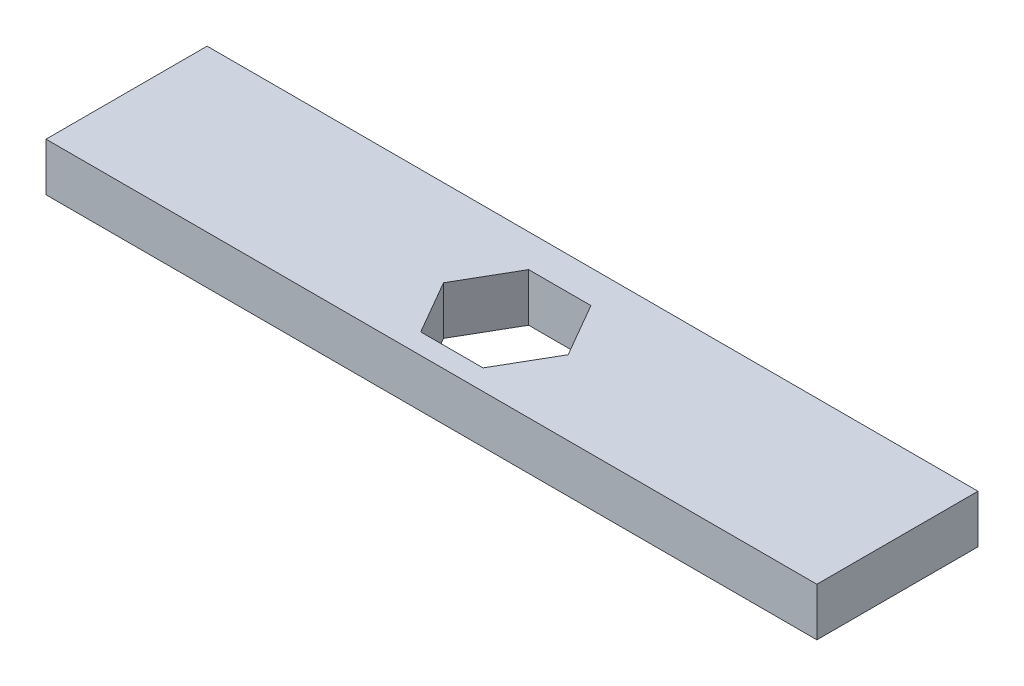
ISO-10303-21;
HEADER;
FILE_DESCRIPTION(('STEP AP214'),'2;1');
FILE_NAME('part.step','',(''),(''),'','','');
FILE_SCHEMA(('AUTOMOTIVE_DESIGN { 1 0 10303 214 1 1 1 1 }'));
ENDSEC;
DATA;
#1=APPLICATION_CONTEXT('core data for automotive mechanical design processes');
#2=APPLICATION_PROTOCOL_DEFINITION('international standard','automotive_design',2000,#1);
#3=PRODUCT_CONTEXT('',#1,'mechanical');
#4=PRODUCT('Part','Part','',(#3));
#5=PRODUCT_RELATED_PRODUCT_CATEGORY('part','',(#4));
#6=PRODUCT_DEFINITION_FORMATION('','',#4);
#7=PRODUCT_DEFINITION_CONTEXT('part definition',#1,'design');
#8=PRODUCT_DEFINITION('design','',#6,#7);
#9=PRODUCT_DEFINITION_SHAPE('','',#8);
#10=(LENGTH_UNIT() NAMED_UNIT(*) SI_UNIT(.MILLI.,.METRE.));
#11=(NAMED_UNIT(*) PLANE_ANGLE_UNIT() SI_UNIT($,.RADIAN.));
#12=(NAMED_UNIT(*) SI_UNIT($,.STERADIAN.) SOLID_ANGLE_UNIT());
#13=UNCERTAINTY_MEASURE_WITH_UNIT(LENGTH_MEASURE(1.E-05),#10,'distance_accuracy_value','');
#14=(GEOMETRIC_REPRESENTATION_CONTEXT(3) GLOBAL_UNCERTAINTY_ASSIGNED_CONTEXT((#13)) GLOBAL_UNIT_ASSIGNED_CONTEXT((#10,
#11,#12)) REPRESENTATION_CONTEXT('',''));
#15=CARTESIAN_POINT('',(0.,0.,0.));
#16=DIRECTION('',(0.,0.,1.));
#17=DIRECTION('',(1.,0.,0.));
#18=AXIS2_PLACEMENT_3D('',#15,#16,#17);
#19=CARTESIAN_POINT('',(0.,2.5,-8.36));
#20=DIRECTION('',(1.,0.,0.));
#21=DIRECTION('',(0.,0.,-1.));
#22=AXIS2_PLACEMENT_3D('',#19,#20,#21);
#23=PLANE('',#22);
#24=DIRECTION('',(0.,0.,1.));
#25=VECTOR('',#24,1.);
#26=CARTESIAN_POINT('',(0.,0.,-8.36));
#27=LINE('',#26,#25);
#28=CARTESIAN_POINT('',(0.,0.,-8.36));
#29=VERTEX_POINT('',#28);
#30=CARTESIAN_POINT('',(0.,0.,0.));
#31=VERTEX_POINT('',#30);
#32=EDGE_CURVE('E171',#29,#31,#27,.T.);
#33=ORIENTED_EDGE('',*,*,#32,.T.);
#34=DIRECTION('',(0.,-1.,0.));
#35=VECTOR('',#34,1.);
#36=CARTESIAN_POINT('',(0.,2.5,0.));
#37=LINE('',#36,#35);
#38=CARTESIAN_POINT('',(0.,2.5,0.));
#39=VERTEX_POINT('',#38);
#40=EDGE_CURVE('E11',#39,#31,#37,.T.);
#41=ORIENTED_EDGE('',*,*,#40,.F.);
#42=DIRECTION('',(0.,0.,1.));
#43=VECTOR('',#42,1.);
#44=CARTESIAN_POINT('',(0.,2.5,-8.36));
#45=LINE('',#44,#43);
#46=CARTESIAN_POINT('',(0.,2.5,-8.36));
#47=VERTEX_POINT('',#46);
#48=EDGE_CURVE('E173',#47,#39,#45,.T.);
#49=ORIENTED_EDGE('',*,*,#48,.F.);
#50=DIRECTION('',(0.,-1.,0.));
#51=VECTOR('',#50,1.);
#52=CARTESIAN_POINT('',(0.,2.5,-8.36));
#53=LINE('',#52,#51);
#54=EDGE_CURVE('E187',#47,#29,#53,.T.);
#55=ORIENTED_EDGE('',*,*,#54,.T.);
#56=EDGE_LOOP('',(#33,#41,#49,#55));
#57=FACE_BOUND('',#56,.T.);
#58=ADVANCED_FACE('F41',(#57),#23,.F.);
#59=CARTESIAN_POINT('',(0.,2.5,0.));
#60=DIRECTION('',(0.,0.,-1.));
#61=DIRECTION('',(-1.,0.,0.));
#62=AXIS2_PLACEMENT_3D('',#59,#60,#61);
#63=PLANE('',#62);
#64=DIRECTION('',(1.,0.,0.));
#65=VECTOR('',#64,1.);
#66=CARTESIAN_POINT('',(0.,0.,0.));
#67=LINE('',#66,#65);
#68=CARTESIAN_POINT('',(40.,0.,0.));
#69=VERTEX_POINT('',#68);
#70=EDGE_CURVE('E191',#31,#69,#67,.T.);
#71=ORIENTED_EDGE('',*,*,#70,.T.);
#72=DIRECTION('',(0.,-1.,0.));
#73=VECTOR('',#72,1.);
#74=CARTESIAN_POINT('',(40.,2.5,0.));
#75=LINE('',#74,#73);
#76=CARTESIAN_POINT('',(40.,2.5,0.));
#77=VERTEX_POINT('',#76);
#78=EDGE_CURVE('E49',#77,#69,#75,.T.);
#79=ORIENTED_EDGE('',*,*,#78,.F.);
#80=DIRECTION('',(1.,0.,0.));
#81=VECTOR('',#80,1.);
#82=CARTESIAN_POINT('',(0.,2.5,0.));
#83=LINE('',#82,#81);
#84=EDGE_CURVE('E177',#39,#77,#83,.T.);
#85=ORIENTED_EDGE('',*,*,#84,.F.);
#86=ORIENTED_EDGE('',*,*,#40,.T.);
#87=EDGE_LOOP('',(#71,#79,#85,#86));
#88=FACE_BOUND('',#87,.T.);
#89=ADVANCED_FACE('F225',(#88),#63,.F.);
#90=CARTESIAN_POINT('',(40.,2.5,0.));
#91=DIRECTION('',(-1.,0.,0.));
#92=DIRECTION('',(0.,0.,1.));
#93=AXIS2_PLACEMENT_3D('',#90,#91,#92);
#94=PLANE('',#93);
#95=DIRECTION('',(0.,0.,-1.));
#96=VECTOR('',#95,1.);
#97=CARTESIAN_POINT('',(40.,0.,0.));
#98=LINE('',#97,#96);
#99=CARTESIAN_POINT('',(40.,0.,-8.36));
#100=VERTEX_POINT('',#99);
#101=EDGE_CURVE('E194',#69,#100,#98,.T.);
#102=ORIENTED_EDGE('',*,*,#101,.T.);
#103=DIRECTION('',(0.,-1.,0.));
#104=VECTOR('',#103,1.);
#105=CARTESIAN_POINT('',(40.,2.5,-8.36));
#106=LINE('',#105,#104);
#107=CARTESIAN_POINT('',(40.,2.5,-8.36));
#108=VERTEX_POINT('',#107);
#109=EDGE_CURVE('E202',#108,#100,#106,.T.);
#110=ORIENTED_EDGE('',*,*,#109,.F.);
#111=DIRECTION('',(0.,0.,-1.));
#112=VECTOR('',#111,1.);
#113=CARTESIAN_POINT('',(40.,2.5,0.));
#114=LINE('',#113,#112);
#115=EDGE_CURVE('E181',#77,#108,#114,.T.);
#116=ORIENTED_EDGE('',*,*,#115,.F.);
#117=ORIENTED_EDGE('',*,*,#78,.T.);
#118=EDGE_LOOP('',(#102,#110,#116,#117));
#119=FACE_BOUND('',#118,.T.);
#120=ADVANCED_FACE('F211',(#119),#94,.F.);
#121=CARTESIAN_POINT('',(40.,2.5,-8.36));
#122=DIRECTION('',(0.,0.,1.));
#123=DIRECTION('',(1.,0.,0.));
#124=AXIS2_PLACEMENT_3D('',#121,#122,#123);
#125=PLANE('',#124);
#126=DIRECTION('',(-1.,0.,0.));
#127=VECTOR('',#126,1.);
#128=CARTESIAN_POINT('',(40.,0.,-8.36));
#129=LINE('',#128,#127);
#130=EDGE_CURVE('E178',#100,#29,#129,.T.);
#131=ORIENTED_EDGE('',*,*,#130,.T.);
#132=ORIENTED_EDGE('',*,*,#54,.F.);
#133=DIRECTION('',(-1.,0.,0.));
#134=VECTOR('',#133,1.);
#135=CARTESIAN_POINT('',(40.,2.5,-8.36));
#136=LINE('',#135,#134);
#137=EDGE_CURVE('E184',#108,#47,#136,.T.);
#138=ORIENTED_EDGE('',*,*,#137,.F.);
#139=ORIENTED_EDGE('',*,*,#109,.T.);
#140=EDGE_LOOP('',(#131,#132,#138,#139));
#141=FACE_BOUND('',#140,.T.);
#142=ADVANCED_FACE('F220',(#141),#125,.F.);
#143=CARTESIAN_POINT('',(0.,2.5,0.));
#144=DIRECTION('',(0.,1.,0.));
#145=DIRECTION('',(0.,0.,1.));
#146=AXIS2_PLACEMENT_3D('',#143,#144,#145);
#147=PLANE('',#146);
#148=DIRECTION('',(0.499999999999999,0.,-0.866025403784439));
#149=VECTOR('',#148,1.);
#150=CARTESIAN_POINT('',(21.616580753731,2.5,-1.06000000000001));
#151=LINE('',#150,#149);
#152=CARTESIAN_POINT('',(21.616580753731,2.5,-1.06000000000001));
#153=VERTEX_POINT('',#152);
#154=CARTESIAN_POINT('',(23.2331615074619,2.5,-3.86000000000001));
#155=VERTEX_POINT('',#154);
#156=EDGE_CURVE('E56',#153,#155,#151,.T.);
#157=ORIENTED_EDGE('',*,*,#156,.F.);
#158=DIRECTION('',(1.,0.,0.));
#159=VECTOR('',#158,1.);
#160=CARTESIAN_POINT('',(18.3834192462691,2.5,-1.06000000000001));
#161=LINE('',#160,#159);
#162=CARTESIAN_POINT('',(18.3834192462691,2.5,-1.06000000000001));
#163=VERTEX_POINT('',#162);
#164=EDGE_CURVE('E151',#163,#153,#161,.T.);
#165=ORIENTED_EDGE('',*,*,#164,.F.);
#166=DIRECTION('',(0.5,0.,0.866025403784438));
#167=VECTOR('',#166,1.);
#168=CARTESIAN_POINT('',(16.7668384925381,2.5,-3.86000000000001));
#169=LINE('',#168,#167);
#170=CARTESIAN_POINT('',(16.7668384925381,2.5,-3.86000000000001));
#171=VERTEX_POINT('',#170);
#172=EDGE_CURVE('E144',#171,#163,#169,.T.);
#173=ORIENTED_EDGE('',*,*,#172,.F.);
#174=DIRECTION('',(-0.5,0.,0.866025403784439));
#175=VECTOR('',#174,1.);
#176=CARTESIAN_POINT('',(18.3834192462691,2.5,-6.66000000000001));
#177=LINE('',#176,#175);
#178=CARTESIAN_POINT('',(18.3834192462691,2.5,-6.66000000000001));
#179=VERTEX_POINT('',#178);
#180=EDGE_CURVE('E140',#179,#171,#177,.T.);
#181=ORIENTED_EDGE('',*,*,#180,.F.);
#182=DIRECTION('',(-1.,0.,0.));
#183=VECTOR('',#182,1.);
#184=CARTESIAN_POINT('',(21.616580753731,2.5,-6.66000000000001));
#185=LINE('',#184,#183);
#186=CARTESIAN_POINT('',(21.616580753731,2.5,-6.66000000000001));
#187=VERTEX_POINT('',#186);
#188=EDGE_CURVE('E121',#187,#179,#185,.T.);
#189=ORIENTED_EDGE('',*,*,#188,.F.);
#190=DIRECTION('',(-0.5,0.,-0.866025403784439));
#191=VECTOR('',#190,1.);
#192=CARTESIAN_POINT('',(23.2331615074619,2.5,-3.86000000000001));
#193=LINE('',#192,#191);
#194=EDGE_CURVE('E131',#155,#187,#193,.T.);
#195=ORIENTED_EDGE('',*,*,#194,.F.);
#196=EDGE_LOOP('',(#157,#165,#173,#181,#189,#195));
#197=FACE_BOUND('',#196,.T.);
#198=ORIENTED_EDGE('',*,*,#48,.T.);
#199=ORIENTED_EDGE('',*,*,#84,.T.);
#200=ORIENTED_EDGE('',*,*,#115,.T.);
#201=ORIENTED_EDGE('',*,*,#137,.T.);
#202=EDGE_LOOP('',(#198,#199,#200,#201));
#203=FACE_BOUND('',#202,.T.);
#204=ADVANCED_FACE('F136',(#197,#203),#147,.T.);
#205=CARTESIAN_POINT('',(0.,0.,0.));
#206=DIRECTION('',(0.,1.,0.));
#207=DIRECTION('',(0.,0.,1.));
#208=AXIS2_PLACEMENT_3D('',#205,#206,#207);
#209=PLANE('',#208);
#210=DIRECTION('',(-1.,0.,0.));
#211=VECTOR('',#210,1.);
#212=CARTESIAN_POINT('',(18.3834192462691,0.,-1.06000000000001));
#213=LINE('',#212,#211);
#214=CARTESIAN_POINT('',(21.616580753731,0.,-1.06000000000001));
#215=VERTEX_POINT('',#214);
#216=CARTESIAN_POINT('',(18.3834192462691,0.,-1.06000000000001));
#217=VERTEX_POINT('',#216);
#218=EDGE_CURVE('E262',#215,#217,#213,.T.);
#219=ORIENTED_EDGE('',*,*,#218,.F.);
#220=DIRECTION('',(-0.5,0.,0.866025403784439));
#221=VECTOR('',#220,1.);
#222=CARTESIAN_POINT('',(21.616580753731,0.,-1.06000000000001));
#223=LINE('',#222,#221);
#224=CARTESIAN_POINT('',(23.2331615074619,0.,-3.86000000000001));
#225=VERTEX_POINT('',#224);
#226=EDGE_CURVE('E172',#225,#215,#223,.T.);
#227=ORIENTED_EDGE('',*,*,#226,.F.);
#228=DIRECTION('',(0.5,0.,0.866025403784439));
#229=VECTOR('',#228,1.);
#230=CARTESIAN_POINT('',(23.2331615074619,0.,-3.86000000000001));
#231=LINE('',#230,#229);
#232=CARTESIAN_POINT('',(21.616580753731,0.,-6.66000000000001));
#233=VERTEX_POINT('',#232);
#234=EDGE_CURVE('E168',#233,#225,#231,.T.);
#235=ORIENTED_EDGE('',*,*,#234,.F.);
#236=DIRECTION('',(1.,0.,0.));
#237=VECTOR('',#236,1.);
#238=CARTESIAN_POINT('',(21.616580753731,0.,-6.66000000000001));
#239=LINE('',#238,#237);
#240=CARTESIAN_POINT('',(18.3834192462691,0.,-6.66000000000001));
#241=VERTEX_POINT('',#240);
#242=EDGE_CURVE('E124',#241,#233,#239,.T.);
#243=ORIENTED_EDGE('',*,*,#242,.F.);
#244=DIRECTION('',(0.5,0.,-0.866025403784439));
#245=VECTOR('',#244,1.);
#246=CARTESIAN_POINT('',(18.3834192462691,0.,-6.66000000000001));
#247=LINE('',#246,#245);
#248=CARTESIAN_POINT('',(16.7668384925381,0.,-3.86000000000001));
#249=VERTEX_POINT('',#248);
#250=EDGE_CURVE('E272',#249,#241,#247,.T.);
#251=ORIENTED_EDGE('',*,*,#250,.F.);
#252=DIRECTION('',(-0.5,0.,-0.866025403784439));
#253=VECTOR('',#252,1.);
#254=CARTESIAN_POINT('',(16.7668384925381,0.,-3.86000000000001));
#255=LINE('',#254,#253);
#256=EDGE_CURVE('E267',#217,#249,#255,.T.);
#257=ORIENTED_EDGE('',*,*,#256,.F.);
#258=EDGE_LOOP('',(#219,#227,#235,#243,#251,#257));
#259=FACE_BOUND('',#258,.T.);
#260=ORIENTED_EDGE('',*,*,#32,.F.);
#261=ORIENTED_EDGE('',*,*,#130,.F.);
#262=ORIENTED_EDGE('',*,*,#101,.F.);
#263=ORIENTED_EDGE('',*,*,#70,.F.);
#264=EDGE_LOOP('',(#260,#261,#262,#263));
#265=FACE_BOUND('',#264,.T.);
#266=ADVANCED_FACE('F217',(#259,#265),#209,.F.);
#267=CARTESIAN_POINT('',(21.616580753731,-8.5541412972509,-1.06000000000001));
#268=DIRECTION('',(0.866025403784439,0.,0.499999999999999));
#269=DIRECTION('',(0.5,0.,-0.866025403784439));
#270=AXIS2_PLACEMENT_3D('',#267,#268,#269);
#271=PLANE('',#270);
#272=ORIENTED_EDGE('',*,*,#226,.T.);
#273=DIRECTION('',(0.,1.,0.));
#274=VECTOR('',#273,1.);
#275=CARTESIAN_POINT('',(21.616580753731,-8.5541412972509,-1.06000000000001));
#276=LINE('',#275,#274);
#277=EDGE_CURVE('E155',#215,#153,#276,.T.);
#278=ORIENTED_EDGE('',*,*,#277,.T.);
#279=ORIENTED_EDGE('',*,*,#156,.T.);
#280=DIRECTION('',(0.,1.,0.));
#281=VECTOR('',#280,1.);
#282=CARTESIAN_POINT('',(23.2331615074619,-8.5541412972509,-3.86000000000001));
#283=LINE('',#282,#281);
#284=EDGE_CURVE('E128',#225,#155,#283,.T.);
#285=ORIENTED_EDGE('',*,*,#284,.F.);
#286=EDGE_LOOP('',(#272,#278,#279,#285));
#287=FACE_BOUND('',#286,.T.);
#288=ADVANCED_FACE('F237',(#287),#271,.F.);
#289=CARTESIAN_POINT('',(18.3834192462691,-8.5541412972509,-1.06000000000001));
#290=DIRECTION('',(0.,0.,1.));
#291=DIRECTION('',(1.,0.,0.));
#292=AXIS2_PLACEMENT_3D('',#289,#290,#291);
#293=PLANE('',#292);
#294=ORIENTED_EDGE('',*,*,#218,.T.);
#295=DIRECTION('',(0.,1.,0.));
#296=VECTOR('',#295,1.);
#297=CARTESIAN_POINT('',(18.3834192462691,-8.5541412972509,-1.06000000000001));
#298=LINE('',#297,#296);
#299=EDGE_CURVE('E158',#217,#163,#298,.T.);
#300=ORIENTED_EDGE('',*,*,#299,.T.);
#301=ORIENTED_EDGE('',*,*,#164,.T.);
#302=ORIENTED_EDGE('',*,*,#277,.F.);
#303=EDGE_LOOP('',(#294,#300,#301,#302));
#304=FACE_BOUND('',#303,.T.);
#305=ADVANCED_FACE('F243',(#304),#293,.F.);
#306=CARTESIAN_POINT('',(16.7668384925381,-8.5541412972509,-3.86000000000001));
#307=DIRECTION('',(-0.866025403784438,0.,0.5));
#308=DIRECTION('',(0.5,0.,0.866025403784439));
#309=AXIS2_PLACEMENT_3D('',#306,#307,#308);
#310=PLANE('',#309);
#311=ORIENTED_EDGE('',*,*,#256,.T.);
#312=DIRECTION('',(0.,1.,0.));
#313=VECTOR('',#312,1.);
#314=CARTESIAN_POINT('',(16.7668384925381,-8.5541412972509,-3.86000000000001));
#315=LINE('',#314,#313);
#316=EDGE_CURVE('E161',#249,#171,#315,.T.);
#317=ORIENTED_EDGE('',*,*,#316,.T.);
#318=ORIENTED_EDGE('',*,*,#172,.T.);
#319=ORIENTED_EDGE('',*,*,#299,.F.);
#320=EDGE_LOOP('',(#311,#317,#318,#319));
#321=FACE_BOUND('',#320,.T.);
#322=ADVANCED_FACE('F251',(#321),#310,.F.);
#323=CARTESIAN_POINT('',(18.3834192462691,-8.5541412972509,-6.66000000000001));
#324=DIRECTION('',(-0.866025403784439,0.,-0.5));
#325=DIRECTION('',(-0.5,0.,0.866025403784439));
#326=AXIS2_PLACEMENT_3D('',#323,#324,#325);
#327=PLANE('',#326);
#328=ORIENTED_EDGE('',*,*,#250,.T.);
#329=DIRECTION('',(0.,1.,0.));
#330=VECTOR('',#329,1.);
#331=CARTESIAN_POINT('',(18.3834192462691,-8.5541412972509,-6.66000000000001));
#332=LINE('',#331,#330);
#333=EDGE_CURVE('E127',#241,#179,#332,.T.);
#334=ORIENTED_EDGE('',*,*,#333,.T.);
#335=ORIENTED_EDGE('',*,*,#180,.T.);
#336=ORIENTED_EDGE('',*,*,#316,.F.);
#337=EDGE_LOOP('',(#328,#334,#335,#336));
#338=FACE_BOUND('',#337,.T.);
#339=ADVANCED_FACE('F248',(#338),#327,.F.);
#340=CARTESIAN_POINT('',(21.616580753731,-8.5541412972509,-6.66000000000001));
#341=DIRECTION('',(0.,0.,-1.));
#342=DIRECTION('',(-1.,0.,0.));
#343=AXIS2_PLACEMENT_3D('',#340,#341,#342);
#344=PLANE('',#343);
#345=ORIENTED_EDGE('',*,*,#242,.T.);
#346=DIRECTION('',(0.,1.,0.));
#347=VECTOR('',#346,1.);
#348=CARTESIAN_POINT('',(21.616580753731,-8.5541412972509,-6.66000000000001));
#349=LINE('',#348,#347);
#350=EDGE_CURVE('E64',#233,#187,#349,.T.);
#351=ORIENTED_EDGE('',*,*,#350,.T.);
#352=ORIENTED_EDGE('',*,*,#188,.T.);
#353=ORIENTED_EDGE('',*,*,#333,.F.);
#354=EDGE_LOOP('',(#345,#351,#352,#353));
#355=FACE_BOUND('',#354,.T.);
#356=ADVANCED_FACE('F118',(#355),#344,.F.);
#357=CARTESIAN_POINT('',(23.2331615074619,-8.5541412972509,-3.86000000000001));
#358=DIRECTION('',(0.866025403784439,0.,-0.5));
#359=DIRECTION('',(-0.5,0.,-0.866025403784439));
#360=AXIS2_PLACEMENT_3D('',#357,#358,#359);
#361=PLANE('',#360);
#362=ORIENTED_EDGE('',*,*,#234,.T.);
#363=ORIENTED_EDGE('',*,*,#284,.T.);
#364=ORIENTED_EDGE('',*,*,#194,.T.);
#365=ORIENTED_EDGE('',*,*,#350,.F.);
#366=EDGE_LOOP('',(#362,#363,#364,#365));
#367=FACE_BOUND('',#366,.T.);
#368=ADVANCED_FACE('F132',(#367),#361,.F.);
#369=CLOSED_SHELL('',(#58,#89,#120,#142,#204,#266,#288,#305,#322,#339,#356,#368));
#370=MANIFOLD_SOLID_BREP('B2',#369);
#371=ADVANCED_BREP_SHAPE_REPRESENTATION('',(#18,#370),#14);
#372=SHAPE_DEFINITION_REPRESENTATION(#9,#371);
ENDSEC;
END-ISO-10303-21;
